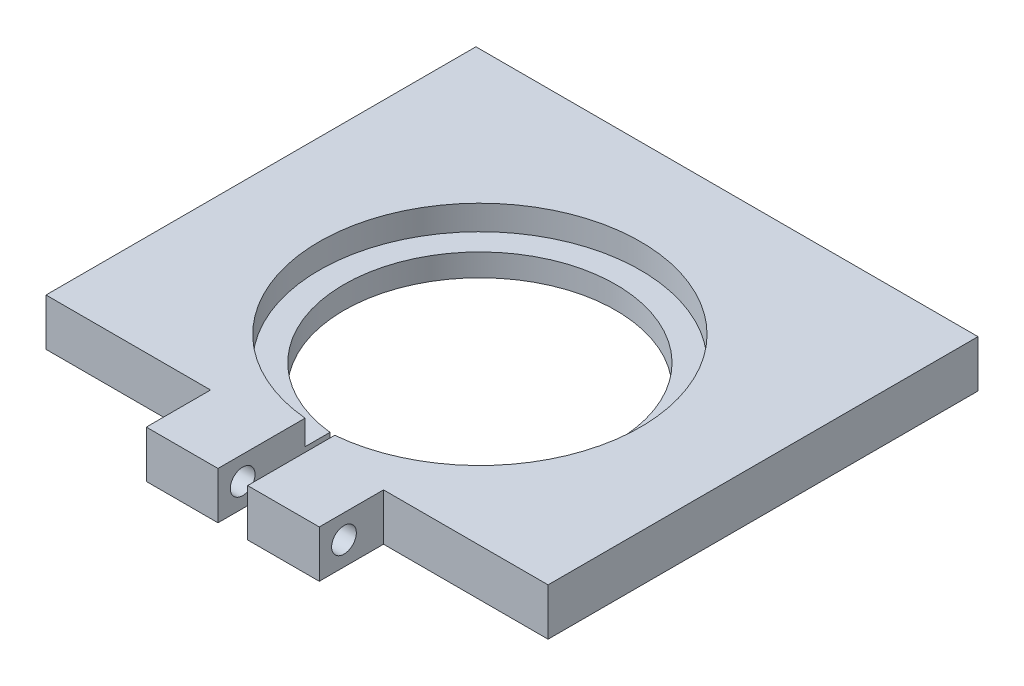
ISO-10303-21;
HEADER;
FILE_DESCRIPTION(('STEP AP214'),'2;1');
FILE_NAME('part.step','',(''),(''),'','','');
FILE_SCHEMA(('AUTOMOTIVE_DESIGN { 1 0 10303 214 1 1 1 1 }'));
ENDSEC;
DATA;
#1=APPLICATION_CONTEXT('core data for automotive mechanical design processes');
#2=APPLICATION_PROTOCOL_DEFINITION('international standard','automotive_design',2000,#1);
#3=PRODUCT_CONTEXT('',#1,'mechanical');
#4=PRODUCT('Part','Part','',(#3));
#5=PRODUCT_RELATED_PRODUCT_CATEGORY('part','',(#4));
#6=PRODUCT_DEFINITION_FORMATION('','',#4);
#7=PRODUCT_DEFINITION_CONTEXT('part definition',#1,'design');
#8=PRODUCT_DEFINITION('design','',#6,#7);
#9=PRODUCT_DEFINITION_SHAPE('','',#8);
#10=(LENGTH_UNIT() NAMED_UNIT(*) SI_UNIT(.MILLI.,.METRE.));
#11=(NAMED_UNIT(*) PLANE_ANGLE_UNIT() SI_UNIT($,.RADIAN.));
#12=(NAMED_UNIT(*) SI_UNIT($,.STERADIAN.) SOLID_ANGLE_UNIT());
#13=UNCERTAINTY_MEASURE_WITH_UNIT(LENGTH_MEASURE(1.E-05),#10,'distance_accuracy_value','');
#14=(GEOMETRIC_REPRESENTATION_CONTEXT(3) GLOBAL_UNCERTAINTY_ASSIGNED_CONTEXT((#13)) GLOBAL_UNIT_ASSIGNED_CONTEXT((#10,
#11,#12)) REPRESENTATION_CONTEXT('',''));
#15=CARTESIAN_POINT('',(0.,0.,0.));
#16=DIRECTION('',(0.,0.,1.));
#17=DIRECTION('',(1.,0.,0.));
#18=AXIS2_PLACEMENT_3D('',#15,#16,#17);
#19=CARTESIAN_POINT('',(-50.8,9.53,50.));
#20=DIRECTION('',(0.,0.,-1.));
#21=DIRECTION('',(-1.,0.,0.));
#22=AXIS2_PLACEMENT_3D('',#19,#20,#21);
#23=PLANE('',#22);
#24=DIRECTION('',(1.,0.,0.));
#25=VECTOR('',#24,1.);
#26=CARTESIAN_POINT('',(-50.8,9.53,50.));
#27=LINE('',#26,#25);
#28=CARTESIAN_POINT('',(3.00000000000001,9.53,50.));
#29=VERTEX_POINT('',#28);
#30=CARTESIAN_POINT('',(17.5,9.53,50.));
#31=VERTEX_POINT('',#30);
#32=EDGE_CURVE('E197',#29,#31,#27,.T.);
#33=ORIENTED_EDGE('',*,*,#32,.F.);
#34=DIRECTION('',(0.,1.,0.));
#35=VECTOR('',#34,1.);
#36=CARTESIAN_POINT('',(3.00000000000001,-0.000999999999999265,50.));
#37=LINE('',#36,#35);
#38=CARTESIAN_POINT('',(3.00000000000001,0.,50.));
#39=VERTEX_POINT('',#38);
#40=EDGE_CURVE('E136',#39,#29,#37,.T.);
#41=ORIENTED_EDGE('',*,*,#40,.F.);
#42=DIRECTION('',(1.,0.,0.));
#43=VECTOR('',#42,1.);
#44=CARTESIAN_POINT('',(-50.8,0.,50.));
#45=LINE('',#44,#43);
#46=CARTESIAN_POINT('',(17.5,0.,50.));
#47=VERTEX_POINT('',#46);
#48=EDGE_CURVE('E208',#39,#47,#45,.T.);
#49=ORIENTED_EDGE('',*,*,#48,.T.);
#50=DIRECTION('',(0.,1.,0.));
#51=VECTOR('',#50,1.);
#52=CARTESIAN_POINT('',(17.5,-0.000999999999999265,50.));
#53=LINE('',#52,#51);
#54=EDGE_CURVE('E251',#47,#31,#53,.T.);
#55=ORIENTED_EDGE('',*,*,#54,.T.);
#56=EDGE_LOOP('',(#33,#41,#49,#55));
#57=FACE_BOUND('',#56,.T.);
#58=ADVANCED_FACE('F31',(#57),#23,.F.);
#59=CARTESIAN_POINT('',(-50.8,9.53,-50.));
#60=DIRECTION('',(0.,0.,-1.));
#61=DIRECTION('',(-1.,0.,0.));
#62=AXIS2_PLACEMENT_3D('',#59,#60,#61);
#63=PLANE('',#62);
#64=CARTESIAN_POINT('',(-45.8000000000001,4.76000000000008,-50.));
#65=DIRECTION('',(0.,0.,-1.));
#66=DIRECTION('',(-1.,0.,0.));
#67=AXIS2_PLACEMENT_3D('',#64,#65,#66);
#68=CIRCLE('',#67,2.6);
#69=CARTESIAN_POINT('',(-48.4000000000001,4.76000000000008,-50.));
#70=VERTEX_POINT('',#69);
#71=EDGE_CURVE('E159',#70,#70,#68,.T.);
#72=ORIENTED_EDGE('',*,*,#71,.F.);
#73=EDGE_LOOP('',(#72));
#74=FACE_BOUND('',#73,.T.);
#75=CARTESIAN_POINT('',(-22.8,4.76000000000003,-50.));
#76=DIRECTION('',(0.,0.,-1.));
#77=DIRECTION('',(-1.,0.,0.));
#78=AXIS2_PLACEMENT_3D('',#75,#76,#77);
#79=CIRCLE('',#78,2.6);
#80=CARTESIAN_POINT('',(-25.4,4.76000000000003,-50.));
#81=VERTEX_POINT('',#80);
#82=EDGE_CURVE('E169',#81,#81,#79,.T.);
#83=ORIENTED_EDGE('',*,*,#82,.F.);
#84=EDGE_LOOP('',(#83));
#85=FACE_BOUND('',#84,.T.);
#86=CARTESIAN_POINT('',(22.8,4.76000000000003,-50.));
#87=DIRECTION('',(0.,0.,-1.));
#88=DIRECTION('',(-1.,0.,0.));
#89=AXIS2_PLACEMENT_3D('',#86,#87,#88);
#90=CIRCLE('',#89,2.6);
#91=CARTESIAN_POINT('',(20.2,4.76000000000003,-50.));
#92=VERTEX_POINT('',#91);
#93=EDGE_CURVE('E175',#92,#92,#90,.T.);
#94=ORIENTED_EDGE('',*,*,#93,.F.);
#95=EDGE_LOOP('',(#94));
#96=FACE_BOUND('',#95,.T.);
#97=CARTESIAN_POINT('',(45.7999999999999,4.75999999999997,-50.));
#98=DIRECTION('',(0.,0.,-1.));
#99=DIRECTION('',(-1.,0.,0.));
#100=AXIS2_PLACEMENT_3D('',#97,#98,#99);
#101=CIRCLE('',#100,2.6);
#102=CARTESIAN_POINT('',(43.1999999999999,4.75999999999997,-50.));
#103=VERTEX_POINT('',#102);
#104=EDGE_CURVE('E181',#103,#103,#101,.T.);
#105=ORIENTED_EDGE('',*,*,#104,.F.);
#106=EDGE_LOOP('',(#105));
#107=FACE_BOUND('',#106,.T.);
#108=DIRECTION('',(1.,0.,0.));
#109=VECTOR('',#108,1.);
#110=CARTESIAN_POINT('',(-50.8,0.,-50.));
#111=LINE('',#110,#109);
#112=CARTESIAN_POINT('',(-50.8,0.,-50.));
#113=VERTEX_POINT('',#112);
#114=CARTESIAN_POINT('',(50.8,0.,-50.));
#115=VERTEX_POINT('',#114);
#116=EDGE_CURVE('E187',#113,#115,#111,.T.);
#117=ORIENTED_EDGE('',*,*,#116,.F.);
#118=DIRECTION('',(0.,-1.,0.));
#119=VECTOR('',#118,1.);
#120=CARTESIAN_POINT('',(-50.8,9.53,-50.));
#121=LINE('',#120,#119);
#122=CARTESIAN_POINT('',(-50.8,9.53,-50.));
#123=VERTEX_POINT('',#122);
#124=EDGE_CURVE('E11',#123,#113,#121,.T.);
#125=ORIENTED_EDGE('',*,*,#124,.F.);
#126=DIRECTION('',(1.,0.,0.));
#127=VECTOR('',#126,1.);
#128=CARTESIAN_POINT('',(-50.8,9.53,-50.));
#129=LINE('',#128,#127);
#130=CARTESIAN_POINT('',(50.8,9.53,-50.));
#131=VERTEX_POINT('',#130);
#132=EDGE_CURVE('E190',#123,#131,#129,.T.);
#133=ORIENTED_EDGE('',*,*,#132,.T.);
#134=DIRECTION('',(0.,-1.,0.));
#135=VECTOR('',#134,1.);
#136=CARTESIAN_POINT('',(50.8,9.53,-50.));
#137=LINE('',#136,#135);
#138=EDGE_CURVE('E40',#131,#115,#137,.T.);
#139=ORIENTED_EDGE('',*,*,#138,.T.);
#140=EDGE_LOOP('',(#117,#125,#133,#139));
#141=FACE_BOUND('',#140,.T.);
#142=ADVANCED_FACE('F33',(#74,#85,#96,#107,#141),#63,.T.);
#143=CARTESIAN_POINT('',(-50.8,9.53,-50.));
#144=DIRECTION('',(1.,0.,0.));
#145=DIRECTION('',(0.,0.,-1.));
#146=AXIS2_PLACEMENT_3D('',#143,#144,#145);
#147=PLANE('',#146);
#148=DIRECTION('',(0.,0.,1.));
#149=VECTOR('',#148,1.);
#150=CARTESIAN_POINT('',(-50.8,0.,-50.));
#151=LINE('',#150,#149);
#152=CARTESIAN_POINT('',(-50.8,0.,37.));
#153=VERTEX_POINT('',#152);
#154=EDGE_CURVE('E194',#113,#153,#151,.T.);
#155=ORIENTED_EDGE('',*,*,#154,.T.);
#156=DIRECTION('',(0.,1.,0.));
#157=VECTOR('',#156,1.);
#158=CARTESIAN_POINT('',(-50.8,-0.000999999999999265,37.));
#159=LINE('',#158,#157);
#160=CARTESIAN_POINT('',(-50.8,9.53,37.));
#161=VERTEX_POINT('',#160);
#162=EDGE_CURVE('E235',#153,#161,#159,.T.);
#163=ORIENTED_EDGE('',*,*,#162,.T.);
#164=DIRECTION('',(0.,0.,1.));
#165=VECTOR('',#164,1.);
#166=CARTESIAN_POINT('',(-50.8,9.53,-50.));
#167=LINE('',#166,#165);
#168=EDGE_CURVE('E200',#123,#161,#167,.T.);
#169=ORIENTED_EDGE('',*,*,#168,.F.);
#170=ORIENTED_EDGE('',*,*,#124,.T.);
#171=EDGE_LOOP('',(#155,#163,#169,#170));
#172=FACE_BOUND('',#171,.T.);
#173=ADVANCED_FACE('F233',(#172),#147,.F.);
#174=CARTESIAN_POINT('',(-17.5,0.,50.));
#175=VERTEX_POINT('',#174);
#176=CARTESIAN_POINT('',(-2.99999999999999,0.,50.));
#177=VERTEX_POINT('',#176);
#178=EDGE_CURVE('E209',#175,#177,#45,.T.);
#179=ORIENTED_EDGE('',*,*,#178,.T.);
#180=DIRECTION('',(0.,1.,0.));
#181=VECTOR('',#180,1.);
#182=CARTESIAN_POINT('',(-2.99999999999999,-0.000999999999999265,50.));
#183=LINE('',#182,#181);
#184=CARTESIAN_POINT('',(-2.99999999999999,9.53,50.));
#185=VERTEX_POINT('',#184);
#186=EDGE_CURVE('E270',#177,#185,#183,.T.);
#187=ORIENTED_EDGE('',*,*,#186,.T.);
#188=CARTESIAN_POINT('',(-17.5,9.53,50.));
#189=VERTEX_POINT('',#188);
#190=EDGE_CURVE('E198',#189,#185,#27,.T.);
#191=ORIENTED_EDGE('',*,*,#190,.F.);
#192=DIRECTION('',(0.,1.,0.));
#193=VECTOR('',#192,1.);
#194=CARTESIAN_POINT('',(-17.5,-0.000999999999999265,50.));
#195=LINE('',#194,#193);
#196=EDGE_CURVE('E283',#175,#189,#195,.T.);
#197=ORIENTED_EDGE('',*,*,#196,.F.);
#198=EDGE_LOOP('',(#179,#187,#191,#197));
#199=FACE_BOUND('',#198,.T.);
#200=ADVANCED_FACE('F293',(#199),#23,.F.);
#201=CARTESIAN_POINT('',(50.8,9.53,-50.));
#202=DIRECTION('',(1.,0.,0.));
#203=DIRECTION('',(0.,0.,-1.));
#204=AXIS2_PLACEMENT_3D('',#201,#202,#203);
#205=PLANE('',#204);
#206=DIRECTION('',(0.,1.,0.));
#207=VECTOR('',#206,1.);
#208=CARTESIAN_POINT('',(50.8,-0.000999999999999265,37.));
#209=LINE('',#208,#207);
#210=CARTESIAN_POINT('',(50.8,0.,37.));
#211=VERTEX_POINT('',#210);
#212=CARTESIAN_POINT('',(50.8,9.53,37.));
#213=VERTEX_POINT('',#212);
#214=EDGE_CURVE('E221',#211,#213,#209,.T.);
#215=ORIENTED_EDGE('',*,*,#214,.F.);
#216=DIRECTION('',(0.,0.,1.));
#217=VECTOR('',#216,1.);
#218=CARTESIAN_POINT('',(50.8,0.,-50.));
#219=LINE('',#218,#217);
#220=EDGE_CURVE('E205',#115,#211,#219,.T.);
#221=ORIENTED_EDGE('',*,*,#220,.F.);
#222=ORIENTED_EDGE('',*,*,#138,.F.);
#223=DIRECTION('',(0.,0.,1.));
#224=VECTOR('',#223,1.);
#225=CARTESIAN_POINT('',(50.8,9.53,-50.));
#226=LINE('',#225,#224);
#227=EDGE_CURVE('E193',#131,#213,#226,.T.);
#228=ORIENTED_EDGE('',*,*,#227,.T.);
#229=EDGE_LOOP('',(#215,#221,#222,#228));
#230=FACE_BOUND('',#229,.T.);
#231=ADVANCED_FACE('F220',(#230),#205,.T.);
#232=CARTESIAN_POINT('',(50.8,9.53,-50.));
#233=DIRECTION('',(0.,-1.,0.));
#234=DIRECTION('',(0.,0.,-1.));
#235=AXIS2_PLACEMENT_3D('',#232,#233,#234);
#236=PLANE('',#235);
#237=CARTESIAN_POINT('',(0.,9.53,0.));
#238=DIRECTION('',(0.,1.,0.));
#239=DIRECTION('',(0.,0.,1.));
#240=AXIS2_PLACEMENT_3D('',#237,#238,#239);
#241=CIRCLE('',#240,32.51);
#242=CARTESIAN_POINT('',(3.00000000000001,9.53,32.3712851150522));
#243=VERTEX_POINT('',#242);
#244=CARTESIAN_POINT('',(-2.99999999999999,9.53,32.3712851150522));
#245=VERTEX_POINT('',#244);
#246=EDGE_CURVE('E148',#243,#245,#241,.T.);
#247=ORIENTED_EDGE('',*,*,#246,.F.);
#248=DIRECTION('',(0.,0.,-1.));
#249=VECTOR('',#248,1.);
#250=CARTESIAN_POINT('',(3.00000000000001,9.53,50.));
#251=LINE('',#250,#249);
#252=EDGE_CURVE('E131',#29,#243,#251,.T.);
#253=ORIENTED_EDGE('',*,*,#252,.F.);
#254=ORIENTED_EDGE('',*,*,#32,.T.);
#255=DIRECTION('',(0.,0.,1.));
#256=VECTOR('',#255,1.);
#257=CARTESIAN_POINT('',(17.5,9.53,50.));
#258=LINE('',#257,#256);
#259=CARTESIAN_POINT('',(17.5,9.53,37.));
#260=VERTEX_POINT('',#259);
#261=EDGE_CURVE('E242',#260,#31,#258,.T.);
#262=ORIENTED_EDGE('',*,*,#261,.F.);
#263=DIRECTION('',(-1.,0.,0.));
#264=VECTOR('',#263,1.);
#265=CARTESIAN_POINT('',(50.8,9.53,37.));
#266=LINE('',#265,#264);
#267=EDGE_CURVE('E240',#213,#260,#266,.T.);
#268=ORIENTED_EDGE('',*,*,#267,.F.);
#269=ORIENTED_EDGE('',*,*,#227,.F.);
#270=ORIENTED_EDGE('',*,*,#132,.F.);
#271=ORIENTED_EDGE('',*,*,#168,.T.);
#272=DIRECTION('',(-1.,0.,0.));
#273=VECTOR('',#272,1.);
#274=CARTESIAN_POINT('',(-50.8,9.53,37.));
#275=LINE('',#274,#273);
#276=CARTESIAN_POINT('',(-17.5,9.53,37.));
#277=VERTEX_POINT('',#276);
#278=EDGE_CURVE('E281',#277,#161,#275,.T.);
#279=ORIENTED_EDGE('',*,*,#278,.F.);
#280=DIRECTION('',(0.,0.,-1.));
#281=VECTOR('',#280,1.);
#282=CARTESIAN_POINT('',(-17.5,9.53,50.));
#283=LINE('',#282,#281);
#284=EDGE_CURVE('E278',#189,#277,#283,.T.);
#285=ORIENTED_EDGE('',*,*,#284,.F.);
#286=ORIENTED_EDGE('',*,*,#190,.T.);
#287=DIRECTION('',(0.,0.,1.));
#288=VECTOR('',#287,1.);
#289=CARTESIAN_POINT('',(-2.99999999999999,9.53,50.));
#290=LINE('',#289,#288);
#291=EDGE_CURVE('E140',#245,#185,#290,.T.);
#292=ORIENTED_EDGE('',*,*,#291,.F.);
#293=EDGE_LOOP('',(#247,#253,#254,#262,#268,#269,#270,#271,#279,#285,#286,#292));
#294=FACE_BOUND('',#293,.T.);
#295=ADVANCED_FACE('F155',(#294),#236,.F.);
#296=CARTESIAN_POINT('',(50.8,0.,-50.));
#297=DIRECTION('',(0.,-1.,0.));
#298=DIRECTION('',(0.,0.,-1.));
#299=AXIS2_PLACEMENT_3D('',#296,#297,#298);
#300=PLANE('',#299);
#301=DIRECTION('',(0.,0.,-1.));
#302=VECTOR('',#301,1.);
#303=CARTESIAN_POINT('',(3.00000000000001,0.,50.));
#304=LINE('',#303,#302);
#305=CARTESIAN_POINT('',(3.00000000000001,0.,27.3358738656733));
#306=VERTEX_POINT('',#305);
#307=EDGE_CURVE('E141',#39,#306,#304,.T.);
#308=ORIENTED_EDGE('',*,*,#307,.T.);
#309=CARTESIAN_POINT('',(0.,0.,0.));
#310=DIRECTION('',(0.,-1.,0.));
#311=DIRECTION('',(0.,0.,-1.));
#312=AXIS2_PLACEMENT_3D('',#309,#310,#311);
#313=CIRCLE('',#312,27.5);
#314=CARTESIAN_POINT('',(-2.99999999999999,0.,27.3358738656733));
#315=VERTEX_POINT('',#314);
#316=EDGE_CURVE('E162',#306,#315,#313,.F.);
#317=ORIENTED_EDGE('',*,*,#316,.T.);
#318=DIRECTION('',(0.,0.,1.));
#319=VECTOR('',#318,1.);
#320=CARTESIAN_POINT('',(-2.99999999999999,0.,50.));
#321=LINE('',#320,#319);
#322=EDGE_CURVE('E56',#315,#177,#321,.T.);
#323=ORIENTED_EDGE('',*,*,#322,.T.);
#324=ORIENTED_EDGE('',*,*,#178,.F.);
#325=DIRECTION('',(0.,0.,-1.));
#326=VECTOR('',#325,1.);
#327=CARTESIAN_POINT('',(-17.5,0.,50.));
#328=LINE('',#327,#326);
#329=CARTESIAN_POINT('',(-17.5,0.,37.));
#330=VERTEX_POINT('',#329);
#331=EDGE_CURVE('E275',#175,#330,#328,.T.);
#332=ORIENTED_EDGE('',*,*,#331,.T.);
#333=DIRECTION('',(-1.,0.,0.));
#334=VECTOR('',#333,1.);
#335=CARTESIAN_POINT('',(-50.8,0.,37.));
#336=LINE('',#335,#334);
#337=EDGE_CURVE('E230',#330,#153,#336,.T.);
#338=ORIENTED_EDGE('',*,*,#337,.T.);
#339=ORIENTED_EDGE('',*,*,#154,.F.);
#340=ORIENTED_EDGE('',*,*,#116,.T.);
#341=ORIENTED_EDGE('',*,*,#220,.T.);
#342=DIRECTION('',(-1.,0.,0.));
#343=VECTOR('',#342,1.);
#344=CARTESIAN_POINT('',(50.8,0.,37.));
#345=LINE('',#344,#343);
#346=CARTESIAN_POINT('',(17.5,0.,37.));
#347=VERTEX_POINT('',#346);
#348=EDGE_CURVE('E254',#211,#347,#345,.T.);
#349=ORIENTED_EDGE('',*,*,#348,.T.);
#350=DIRECTION('',(0.,0.,1.));
#351=VECTOR('',#350,1.);
#352=CARTESIAN_POINT('',(17.5,0.,50.));
#353=LINE('',#352,#351);
#354=EDGE_CURVE('E244',#347,#47,#353,.T.);
#355=ORIENTED_EDGE('',*,*,#354,.T.);
#356=ORIENTED_EDGE('',*,*,#48,.F.);
#357=EDGE_LOOP('',(#308,#317,#323,#324,#332,#338,#339,#340,#341,#349,#355,#356));
#358=FACE_BOUND('',#357,.T.);
#359=ADVANCED_FACE('F226',(#358),#300,.T.);
#360=CARTESIAN_POINT('',(45.7999999999999,4.75999999999997,-30.));
#361=DIRECTION('',(0.,0.,-1.));
#362=DIRECTION('',(-1.,0.,0.));
#363=AXIS2_PLACEMENT_3D('',#360,#361,#362);
#364=CYLINDRICAL_SURFACE('',#363,2.6);
#365=CARTESIAN_POINT('',(45.7999999999999,4.75999999999997,-30.));
#366=DIRECTION('',(0.,0.,-1.));
#367=DIRECTION('',(-1.,0.,0.));
#368=AXIS2_PLACEMENT_3D('',#365,#366,#367);
#369=CIRCLE('',#368,2.6);
#370=CARTESIAN_POINT('',(43.1999999999999,4.75999999999997,-30.));
#371=VERTEX_POINT('',#370);
#372=EDGE_CURVE('E184',#371,#371,#369,.T.);
#373=ORIENTED_EDGE('',*,*,#372,.F.);
#374=EDGE_LOOP('',(#373));
#375=FACE_BOUND('',#374,.T.);
#376=ORIENTED_EDGE('',*,*,#104,.T.);
#377=EDGE_LOOP('',(#376));
#378=FACE_BOUND('',#377,.T.);
#379=ADVANCED_FACE('F345',(#375,#378),#364,.F.);
#380=CARTESIAN_POINT('',(45.7999999999999,4.75999999999997,-30.));
#381=DIRECTION('',(0.,0.,-1.));
#382=DIRECTION('',(-1.,0.,0.));
#383=AXIS2_PLACEMENT_3D('',#380,#381,#382);
#384=PLANE('',#383);
#385=ORIENTED_EDGE('',*,*,#372,.T.);
#386=EDGE_LOOP('',(#385));
#387=FACE_BOUND('',#386,.T.);
#388=ADVANCED_FACE('F350',(#387),#384,.T.);
#389=CARTESIAN_POINT('',(22.8,4.76000000000003,-30.));
#390=DIRECTION('',(0.,0.,-1.));
#391=DIRECTION('',(-1.,0.,0.));
#392=AXIS2_PLACEMENT_3D('',#389,#390,#391);
#393=CYLINDRICAL_SURFACE('',#392,2.6);
#394=CARTESIAN_POINT('',(22.8,4.76000000000003,-30.));
#395=DIRECTION('',(0.,0.,-1.));
#396=DIRECTION('',(-1.,0.,0.));
#397=AXIS2_PLACEMENT_3D('',#394,#395,#396);
#398=CIRCLE('',#397,2.6);
#399=CARTESIAN_POINT('',(20.2,4.76000000000003,-30.));
#400=VERTEX_POINT('',#399);
#401=EDGE_CURVE('E178',#400,#400,#398,.T.);
#402=ORIENTED_EDGE('',*,*,#401,.F.);
#403=EDGE_LOOP('',(#402));
#404=FACE_BOUND('',#403,.T.);
#405=ORIENTED_EDGE('',*,*,#93,.T.);
#406=EDGE_LOOP('',(#405));
#407=FACE_BOUND('',#406,.T.);
#408=ADVANCED_FACE('F354',(#404,#407),#393,.F.);
#409=CARTESIAN_POINT('',(22.8,4.76000000000003,-30.));
#410=DIRECTION('',(0.,0.,-1.));
#411=DIRECTION('',(-1.,0.,0.));
#412=AXIS2_PLACEMENT_3D('',#409,#410,#411);
#413=PLANE('',#412);
#414=ORIENTED_EDGE('',*,*,#401,.T.);
#415=EDGE_LOOP('',(#414));
#416=FACE_BOUND('',#415,.T.);
#417=ADVANCED_FACE('F358',(#416),#413,.T.);
#418=CARTESIAN_POINT('',(-22.8,4.76000000000003,-30.));
#419=DIRECTION('',(0.,0.,-1.));
#420=DIRECTION('',(-1.,0.,0.));
#421=AXIS2_PLACEMENT_3D('',#418,#419,#420);
#422=CYLINDRICAL_SURFACE('',#421,2.6);
#423=CARTESIAN_POINT('',(-22.8,4.76000000000003,-30.));
#424=DIRECTION('',(0.,0.,-1.));
#425=DIRECTION('',(-1.,0.,0.));
#426=AXIS2_PLACEMENT_3D('',#423,#424,#425);
#427=CIRCLE('',#426,2.6);
#428=CARTESIAN_POINT('',(-25.4,4.76000000000003,-30.));
#429=VERTEX_POINT('',#428);
#430=EDGE_CURVE('E172',#429,#429,#427,.T.);
#431=ORIENTED_EDGE('',*,*,#430,.F.);
#432=EDGE_LOOP('',(#431));
#433=FACE_BOUND('',#432,.T.);
#434=ORIENTED_EDGE('',*,*,#82,.T.);
#435=EDGE_LOOP('',(#434));
#436=FACE_BOUND('',#435,.T.);
#437=ADVANCED_FACE('F362',(#433,#436),#422,.F.);
#438=CARTESIAN_POINT('',(-22.8,4.76000000000003,-30.));
#439=DIRECTION('',(0.,0.,-1.));
#440=DIRECTION('',(-1.,0.,0.));
#441=AXIS2_PLACEMENT_3D('',#438,#439,#440);
#442=PLANE('',#441);
#443=ORIENTED_EDGE('',*,*,#430,.T.);
#444=EDGE_LOOP('',(#443));
#445=FACE_BOUND('',#444,.T.);
#446=ADVANCED_FACE('F366',(#445),#442,.T.);
#447=CARTESIAN_POINT('',(-45.8000000000001,4.76000000000008,-30.));
#448=DIRECTION('',(0.,0.,-1.));
#449=DIRECTION('',(-1.,0.,0.));
#450=AXIS2_PLACEMENT_3D('',#447,#448,#449);
#451=CYLINDRICAL_SURFACE('',#450,2.6);
#452=CARTESIAN_POINT('',(-45.8000000000001,4.76000000000008,-30.));
#453=DIRECTION('',(0.,0.,-1.));
#454=DIRECTION('',(-1.,0.,0.));
#455=AXIS2_PLACEMENT_3D('',#452,#453,#454);
#456=CIRCLE('',#455,2.6);
#457=CARTESIAN_POINT('',(-48.4000000000001,4.76000000000008,-30.));
#458=VERTEX_POINT('',#457);
#459=EDGE_CURVE('E166',#458,#458,#456,.T.);
#460=ORIENTED_EDGE('',*,*,#459,.F.);
#461=EDGE_LOOP('',(#460));
#462=FACE_BOUND('',#461,.T.);
#463=ORIENTED_EDGE('',*,*,#71,.T.);
#464=EDGE_LOOP('',(#463));
#465=FACE_BOUND('',#464,.T.);
#466=ADVANCED_FACE('F370',(#462,#465),#451,.F.);
#467=CARTESIAN_POINT('',(-45.8000000000001,4.76000000000008,-30.));
#468=DIRECTION('',(0.,0.,-1.));
#469=DIRECTION('',(-1.,0.,0.));
#470=AXIS2_PLACEMENT_3D('',#467,#468,#469);
#471=PLANE('',#470);
#472=ORIENTED_EDGE('',*,*,#459,.T.);
#473=EDGE_LOOP('',(#472));
#474=FACE_BOUND('',#473,.T.);
#475=ADVANCED_FACE('F374',(#474),#471,.T.);
#476=CARTESIAN_POINT('',(0.,4.53,0.));
#477=DIRECTION('',(0.,1.,0.));
#478=DIRECTION('',(0.,0.,1.));
#479=AXIS2_PLACEMENT_3D('',#476,#477,#478);
#480=CYLINDRICAL_SURFACE('',#479,32.51);
#481=CARTESIAN_POINT('',(0.,4.53,0.));
#482=DIRECTION('',(0.,1.,0.));
#483=DIRECTION('',(0.,0.,1.));
#484=AXIS2_PLACEMENT_3D('',#481,#482,#483);
#485=CIRCLE('',#484,32.51);
#486=CARTESIAN_POINT('',(3.00000000000001,4.53,32.3712851150522));
#487=VERTEX_POINT('',#486);
#488=CARTESIAN_POINT('',(-2.99999999999999,4.53,32.3712851150522));
#489=VERTEX_POINT('',#488);
#490=EDGE_CURVE('E150',#487,#489,#485,.T.);
#491=ORIENTED_EDGE('',*,*,#490,.F.);
#492=DIRECTION('',(0.,1.,0.));
#493=VECTOR('',#492,1.);
#494=CARTESIAN_POINT('',(3.00000000000001,4.53,32.3712851150522));
#495=LINE('',#494,#493);
#496=EDGE_CURVE('E134',#243,#487,#495,.F.);
#497=ORIENTED_EDGE('',*,*,#496,.F.);
#498=ORIENTED_EDGE('',*,*,#246,.T.);
#499=DIRECTION('',(0.,1.,0.));
#500=VECTOR('',#499,1.);
#501=CARTESIAN_POINT('',(-2.99999999999999,4.53,32.3712851150522));
#502=LINE('',#501,#500);
#503=EDGE_CURVE('E152',#489,#245,#502,.T.);
#504=ORIENTED_EDGE('',*,*,#503,.F.);
#505=EDGE_LOOP('',(#491,#497,#498,#504));
#506=FACE_BOUND('',#505,.T.);
#507=ADVANCED_FACE('F146',(#506),#480,.F.);
#508=CARTESIAN_POINT('',(0.,4.53,0.));
#509=DIRECTION('',(0.,1.,0.));
#510=DIRECTION('',(0.,0.,1.));
#511=AXIS2_PLACEMENT_3D('',#508,#509,#510);
#512=PLANE('',#511);
#513=DIRECTION('',(0.,0.,1.));
#514=VECTOR('',#513,1.);
#515=CARTESIAN_POINT('',(3.00000000000001,4.53,50.));
#516=LINE('',#515,#514);
#517=CARTESIAN_POINT('',(3.00000000000001,4.53,27.3358738656733));
#518=VERTEX_POINT('',#517);
#519=EDGE_CURVE('E48',#518,#487,#516,.T.);
#520=ORIENTED_EDGE('',*,*,#519,.T.);
#521=ORIENTED_EDGE('',*,*,#490,.T.);
#522=DIRECTION('',(0.,0.,-1.));
#523=VECTOR('',#522,1.);
#524=CARTESIAN_POINT('',(-2.99999999999999,4.53,50.));
#525=LINE('',#524,#523);
#526=CARTESIAN_POINT('',(-2.99999999999999,4.53,27.3358738656733));
#527=VERTEX_POINT('',#526);
#528=EDGE_CURVE('E267',#489,#527,#525,.T.);
#529=ORIENTED_EDGE('',*,*,#528,.T.);
#530=CARTESIAN_POINT('',(0.,4.53,0.));
#531=DIRECTION('',(0.,1.,0.));
#532=DIRECTION('',(0.,0.,1.));
#533=AXIS2_PLACEMENT_3D('',#530,#531,#532);
#534=CIRCLE('',#533,27.5);
#535=EDGE_CURVE('E157',#518,#527,#534,.T.);
#536=ORIENTED_EDGE('',*,*,#535,.F.);
#537=EDGE_LOOP('',(#520,#521,#529,#536));
#538=FACE_BOUND('',#537,.T.);
#539=ADVANCED_FACE('F381',(#538),#512,.T.);
#540=CARTESIAN_POINT('',(0.,-0.00100000000000013,0.));
#541=DIRECTION('',(0.,1.,0.));
#542=DIRECTION('',(0.,0.,1.));
#543=AXIS2_PLACEMENT_3D('',#540,#541,#542);
#544=CYLINDRICAL_SURFACE('',#543,27.5);
#545=ORIENTED_EDGE('',*,*,#316,.F.);
#546=DIRECTION('',(0.,1.,0.));
#547=VECTOR('',#546,1.);
#548=CARTESIAN_POINT('',(3.00000000000001,-0.00100000000000013,27.3358738656733));
#549=LINE('',#548,#547);
#550=EDGE_CURVE('E151',#518,#306,#549,.F.);
#551=ORIENTED_EDGE('',*,*,#550,.F.);
#552=ORIENTED_EDGE('',*,*,#535,.T.);
#553=DIRECTION('',(0.,1.,0.));
#554=VECTOR('',#553,1.);
#555=CARTESIAN_POINT('',(-2.99999999999999,-0.00100000000000013,27.3358738656733));
#556=LINE('',#555,#554);
#557=EDGE_CURVE('E265',#315,#527,#556,.T.);
#558=ORIENTED_EDGE('',*,*,#557,.F.);
#559=EDGE_LOOP('',(#545,#551,#552,#558));
#560=FACE_BOUND('',#559,.T.);
#561=ADVANCED_FACE('F263',(#560),#544,.F.);
#562=CARTESIAN_POINT('',(17.5,-0.000999999999999265,50.));
#563=DIRECTION('',(-1.,0.,0.));
#564=DIRECTION('',(0.,0.,1.));
#565=AXIS2_PLACEMENT_3D('',#562,#563,#564);
#566=PLANE('',#565);
#567=CARTESIAN_POINT('',(17.5,4.765,45.));
#568=DIRECTION('',(-1.,0.,0.));
#569=DIRECTION('',(0.,0.,1.));
#570=AXIS2_PLACEMENT_3D('',#567,#568,#569);
#571=CIRCLE('',#570,2.5);
#572=CARTESIAN_POINT('',(17.5,4.765,47.5));
#573=VERTEX_POINT('',#572);
#574=EDGE_CURVE('E303',#573,#573,#571,.F.);
#575=ORIENTED_EDGE('',*,*,#574,.F.);
#576=EDGE_LOOP('',(#575));
#577=FACE_BOUND('',#576,.T.);
#578=DIRECTION('',(0.,1.,0.));
#579=VECTOR('',#578,1.);
#580=CARTESIAN_POINT('',(17.5,-0.000999999999999265,37.));
#581=LINE('',#580,#579);
#582=EDGE_CURVE('E255',#347,#260,#581,.T.);
#583=ORIENTED_EDGE('',*,*,#582,.T.);
#584=ORIENTED_EDGE('',*,*,#261,.T.);
#585=ORIENTED_EDGE('',*,*,#54,.F.);
#586=ORIENTED_EDGE('',*,*,#354,.F.);
#587=EDGE_LOOP('',(#583,#584,#585,#586));
#588=FACE_BOUND('',#587,.T.);
#589=ADVANCED_FACE('F387',(#577,#588),#566,.F.);
#590=CARTESIAN_POINT('',(50.8,-0.000999999999999265,37.));
#591=DIRECTION('',(0.,0.,-1.));
#592=DIRECTION('',(-1.,0.,0.));
#593=AXIS2_PLACEMENT_3D('',#590,#591,#592);
#594=PLANE('',#593);
#595=ORIENTED_EDGE('',*,*,#214,.T.);
#596=ORIENTED_EDGE('',*,*,#267,.T.);
#597=ORIENTED_EDGE('',*,*,#582,.F.);
#598=ORIENTED_EDGE('',*,*,#348,.F.);
#599=EDGE_LOOP('',(#595,#596,#597,#598));
#600=FACE_BOUND('',#599,.T.);
#601=ADVANCED_FACE('F323',(#600),#594,.F.);
#602=CARTESIAN_POINT('',(-50.8,-0.000999999999999265,37.));
#603=DIRECTION('',(0.,0.,-1.));
#604=DIRECTION('',(-1.,0.,0.));
#605=AXIS2_PLACEMENT_3D('',#602,#603,#604);
#606=PLANE('',#605);
#607=DIRECTION('',(0.,1.,0.));
#608=VECTOR('',#607,1.);
#609=CARTESIAN_POINT('',(-17.5,-0.000999999999999265,37.));
#610=LINE('',#609,#608);
#611=EDGE_CURVE('E285',#330,#277,#610,.T.);
#612=ORIENTED_EDGE('',*,*,#611,.T.);
#613=ORIENTED_EDGE('',*,*,#278,.T.);
#614=ORIENTED_EDGE('',*,*,#162,.F.);
#615=ORIENTED_EDGE('',*,*,#337,.F.);
#616=EDGE_LOOP('',(#612,#613,#614,#615));
#617=FACE_BOUND('',#616,.T.);
#618=ADVANCED_FACE('F315',(#617),#606,.F.);
#619=CARTESIAN_POINT('',(-17.5,-0.000999999999999265,50.));
#620=DIRECTION('',(1.,0.,0.));
#621=DIRECTION('',(0.,0.,-1.));
#622=AXIS2_PLACEMENT_3D('',#619,#620,#621);
#623=PLANE('',#622);
#624=CARTESIAN_POINT('',(-17.5,4.765,45.));
#625=DIRECTION('',(-1.,0.,0.));
#626=DIRECTION('',(0.,0.,1.));
#627=AXIS2_PLACEMENT_3D('',#624,#625,#626);
#628=CIRCLE('',#627,2.5);
#629=CARTESIAN_POINT('',(-17.5,4.765,47.5));
#630=VERTEX_POINT('',#629);
#631=EDGE_CURVE('E306',#630,#630,#628,.T.);
#632=ORIENTED_EDGE('',*,*,#631,.F.);
#633=EDGE_LOOP('',(#632));
#634=FACE_BOUND('',#633,.T.);
#635=ORIENTED_EDGE('',*,*,#196,.T.);
#636=ORIENTED_EDGE('',*,*,#284,.T.);
#637=ORIENTED_EDGE('',*,*,#611,.F.);
#638=ORIENTED_EDGE('',*,*,#331,.F.);
#639=EDGE_LOOP('',(#635,#636,#637,#638));
#640=FACE_BOUND('',#639,.T.);
#641=ADVANCED_FACE('F289',(#634,#640),#623,.F.);
#642=CARTESIAN_POINT('',(-2.99999999999999,-0.000999999999999265,50.));
#643=DIRECTION('',(-1.,0.,0.));
#644=DIRECTION('',(0.,0.,1.));
#645=AXIS2_PLACEMENT_3D('',#642,#643,#644);
#646=PLANE('',#645);
#647=CARTESIAN_POINT('',(-3.,4.765,45.));
#648=DIRECTION('',(-1.,0.,0.));
#649=DIRECTION('',(0.,0.,1.));
#650=AXIS2_PLACEMENT_3D('',#647,#648,#649);
#651=CIRCLE('',#650,2.5);
#652=CARTESIAN_POINT('',(-3.,4.765,47.5));
#653=VERTEX_POINT('',#652);
#654=EDGE_CURVE('E300',#653,#653,#651,.T.);
#655=ORIENTED_EDGE('',*,*,#654,.T.);
#656=EDGE_LOOP('',(#655));
#657=FACE_BOUND('',#656,.T.);
#658=ORIENTED_EDGE('',*,*,#557,.T.);
#659=ORIENTED_EDGE('',*,*,#528,.F.);
#660=ORIENTED_EDGE('',*,*,#503,.T.);
#661=ORIENTED_EDGE('',*,*,#291,.T.);
#662=ORIENTED_EDGE('',*,*,#186,.F.);
#663=ORIENTED_EDGE('',*,*,#322,.F.);
#664=EDGE_LOOP('',(#658,#659,#660,#661,#662,#663));
#665=FACE_BOUND('',#664,.T.);
#666=ADVANCED_FACE('F314',(#657,#665),#646,.F.);
#667=CARTESIAN_POINT('',(3.00000000000001,-0.000999999999999265,50.));
#668=DIRECTION('',(1.,0.,0.));
#669=DIRECTION('',(0.,0.,-1.));
#670=AXIS2_PLACEMENT_3D('',#667,#668,#669);
#671=PLANE('',#670);
#672=CARTESIAN_POINT('',(3.00000000000001,4.765,45.));
#673=DIRECTION('',(1.,0.,0.));
#674=DIRECTION('',(0.,0.,-1.));
#675=AXIS2_PLACEMENT_3D('',#672,#673,#674);
#676=CIRCLE('',#675,2.5);
#677=CARTESIAN_POINT('',(3.00000000000001,4.765,42.5));
#678=VERTEX_POINT('',#677);
#679=EDGE_CURVE('E35',#678,#678,#676,.T.);
#680=ORIENTED_EDGE('',*,*,#679,.T.);
#681=EDGE_LOOP('',(#680));
#682=FACE_BOUND('',#681,.T.);
#683=ORIENTED_EDGE('',*,*,#40,.T.);
#684=ORIENTED_EDGE('',*,*,#252,.T.);
#685=ORIENTED_EDGE('',*,*,#496,.T.);
#686=ORIENTED_EDGE('',*,*,#519,.F.);
#687=ORIENTED_EDGE('',*,*,#550,.T.);
#688=ORIENTED_EDGE('',*,*,#307,.F.);
#689=EDGE_LOOP('',(#683,#684,#685,#686,#687,#688));
#690=FACE_BOUND('',#689,.T.);
#691=ADVANCED_FACE('F133',(#682,#690),#671,.F.);
#692=CARTESIAN_POINT('',(24.5710678118655,4.765,45.));
#693=DIRECTION('',(-1.,0.,0.));
#694=DIRECTION('',(0.,0.,1.));
#695=AXIS2_PLACEMENT_3D('',#692,#693,#694);
#696=CYLINDRICAL_SURFACE('',#695,2.5);
#697=ORIENTED_EDGE('',*,*,#574,.T.);
#698=EDGE_LOOP('',(#697));
#699=FACE_BOUND('',#698,.T.);
#700=ORIENTED_EDGE('',*,*,#679,.F.);
#701=EDGE_LOOP('',(#700));
#702=FACE_BOUND('',#701,.T.);
#703=ADVANCED_FACE('F398',(#699,#702),#696,.F.);
#704=ORIENTED_EDGE('',*,*,#631,.T.);
#705=EDGE_LOOP('',(#704));
#706=FACE_BOUND('',#705,.T.);
#707=ORIENTED_EDGE('',*,*,#654,.F.);
#708=EDGE_LOOP('',(#707));
#709=FACE_BOUND('',#708,.T.);
#710=ADVANCED_FACE('F310',(#706,#709),#696,.F.);
#711=CLOSED_SHELL('',(#58,#142,#173,#200,#231,#295,#359,#379,#388,#408,#417,#437,#446,#466,#475,
#507,#539,#561,#589,#601,#618,#641,#666,#691,#703,#710));
#712=MANIFOLD_SOLID_BREP('B2',#711);
#713=ADVANCED_BREP_SHAPE_REPRESENTATION('',(#18,#712),#14);
#714=SHAPE_DEFINITION_REPRESENTATION(#9,#713);
ENDSEC;
END-ISO-10303-21;
